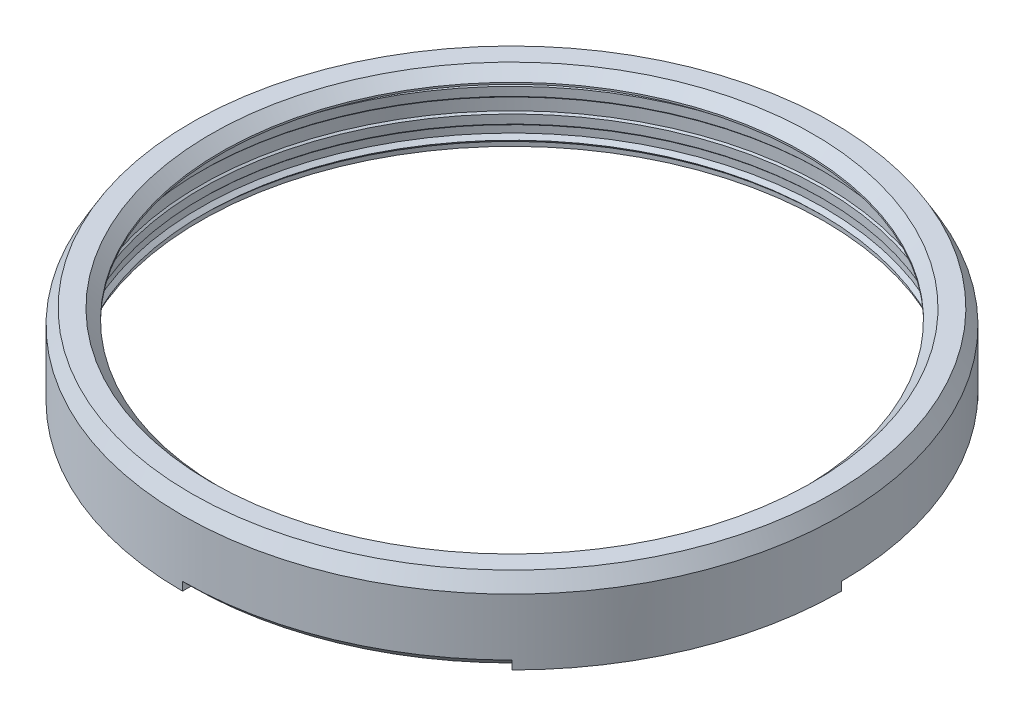
ISO-10303-21;
HEADER;
FILE_DESCRIPTION(('STEP AP214'),'2;1');
FILE_NAME('part.step','',(''),(''),'','','');
FILE_SCHEMA(('AUTOMOTIVE_DESIGN { 1 0 10303 214 1 1 1 1 }'));
ENDSEC;
DATA;
#1=APPLICATION_CONTEXT('core data for automotive mechanical design processes');
#2=APPLICATION_PROTOCOL_DEFINITION('international standard','automotive_design',2000,#1);
#3=PRODUCT_CONTEXT('',#1,'mechanical');
#4=PRODUCT('Part','Part','',(#3));
#5=PRODUCT_RELATED_PRODUCT_CATEGORY('part','',(#4));
#6=PRODUCT_DEFINITION_FORMATION('','',#4);
#7=PRODUCT_DEFINITION_CONTEXT('part definition',#1,'design');
#8=PRODUCT_DEFINITION('design','',#6,#7);
#9=PRODUCT_DEFINITION_SHAPE('','',#8);
#10=(LENGTH_UNIT() NAMED_UNIT(*) SI_UNIT(.MILLI.,.METRE.));
#11=(NAMED_UNIT(*) PLANE_ANGLE_UNIT() SI_UNIT($,.RADIAN.));
#12=(NAMED_UNIT(*) SI_UNIT($,.STERADIAN.) SOLID_ANGLE_UNIT());
#13=UNCERTAINTY_MEASURE_WITH_UNIT(LENGTH_MEASURE(1.E-05),#10,'distance_accuracy_value','');
#14=(GEOMETRIC_REPRESENTATION_CONTEXT(3) GLOBAL_UNCERTAINTY_ASSIGNED_CONTEXT((#13)) GLOBAL_UNIT_ASSIGNED_CONTEXT((#10,
#11,#12)) REPRESENTATION_CONTEXT('',''));
#15=CARTESIAN_POINT('',(0.,0.,0.));
#16=DIRECTION('',(0.,0.,1.));
#17=DIRECTION('',(1.,0.,0.));
#18=AXIS2_PLACEMENT_3D('',#15,#16,#17);
#19=CARTESIAN_POINT('',(0.,-1.39999999999984,0.));
#20=DIRECTION('',(0.,-1.,0.));
#21=DIRECTION('',(0.,0.,-1.));
#22=AXIS2_PLACEMENT_3D('',#19,#20,#21);
#23=TOROIDAL_SURFACE('',#22,35.0300000000002,1.39999999999979);
#24=CARTESIAN_POINT('',(0.,-1.39999999999984,0.));
#25=DIRECTION('',(0.,-1.,0.));
#26=DIRECTION('',(0.,0.,-1.));
#27=AXIS2_PLACEMENT_3D('',#24,#25,#26);
#28=CIRCLE('',#27,36.43);
#29=CARTESIAN_POINT('',(0.,-1.39999999999984,-36.43));
#30=VERTEX_POINT('',#29);
#31=EDGE_CURVE('E261',#30,#30,#28,.T.);
#32=ORIENTED_EDGE('',*,*,#31,.T.);
#33=EDGE_LOOP('',(#32));
#34=FACE_BOUND('',#33,.T.);
#35=CARTESIAN_POINT('',(0.,-0.0225022686044204,0.));
#36=DIRECTION('',(0.,-1.,0.));
#37=DIRECTION('',(0.,0.,-1.));
#38=AXIS2_PLACEMENT_3D('',#35,#36,#37);
#39=CIRCLE('',#38,35.28);
#40=CARTESIAN_POINT('',(0.,-0.0225022686044204,-35.28));
#41=VERTEX_POINT('',#40);
#42=EDGE_CURVE('E43',#41,#41,#39,.F.);
#43=ORIENTED_EDGE('',*,*,#42,.T.);
#44=EDGE_LOOP('',(#43));
#45=FACE_BOUND('',#44,.T.);
#46=ADVANCED_FACE('F38',(#34,#45),#23,.F.);
#47=CARTESIAN_POINT('',(0.,0.,0.));
#48=DIRECTION('',(0.,1.,0.));
#49=DIRECTION('',(0.,0.,1.));
#50=AXIS2_PLACEMENT_3D('',#47,#48,#49);
#51=PLANE('',#50);
#52=CARTESIAN_POINT('',(0.,0.,0.));
#53=DIRECTION('',(0.,1.,0.));
#54=DIRECTION('',(0.,0.,1.));
#55=AXIS2_PLACEMENT_3D('',#52,#53,#54);
#56=CIRCLE('',#55,34.);
#57=CARTESIAN_POINT('',(0.,0.,34.));
#58=VERTEX_POINT('',#57);
#59=EDGE_CURVE('E219',#58,#58,#56,.T.);
#60=ORIENTED_EDGE('',*,*,#59,.T.);
#61=EDGE_LOOP('',(#60));
#62=FACE_BOUND('',#61,.T.);
#63=CARTESIAN_POINT('',(0.,0.,0.));
#64=DIRECTION('',(0.,-1.,0.));
#65=DIRECTION('',(0.,0.,-1.));
#66=AXIS2_PLACEMENT_3D('',#63,#64,#65);
#67=CIRCLE('',#66,34.82);
#68=CARTESIAN_POINT('',(0.,0.,-34.82));
#69=VERTEX_POINT('',#68);
#70=EDGE_CURVE('E356',#69,#69,#67,.T.);
#71=ORIENTED_EDGE('',*,*,#70,.T.);
#72=EDGE_LOOP('',(#71));
#73=FACE_BOUND('',#72,.T.);
#74=ADVANCED_FACE('F292',(#62,#73),#51,.F.);
#75=CARTESIAN_POINT('',(0.,2.,0.));
#76=DIRECTION('',(0.,-1.,0.));
#77=DIRECTION('',(0.,0.,-1.));
#78=AXIS2_PLACEMENT_3D('',#75,#76,#77);
#79=CYLINDRICAL_SURFACE('',#78,38.5);
#80=CARTESIAN_POINT('',(0.,-0.332000000000011,0.));
#81=DIRECTION('',(0.,1.,0.));
#82=DIRECTION('',(0.,0.,1.));
#83=AXIS2_PLACEMENT_3D('',#80,#81,#82);
#84=CIRCLE('',#83,38.5);
#85=CARTESIAN_POINT('',(0.,-0.332000000000011,38.5));
#86=VERTEX_POINT('',#85);
#87=EDGE_CURVE('E269',#86,#86,#84,.F.);
#88=ORIENTED_EDGE('',*,*,#87,.T.);
#89=EDGE_LOOP('',(#88));
#90=FACE_BOUND('',#89,.T.);
#91=DIRECTION('',(0.,1.,0.));
#92=VECTOR('',#91,1.);
#93=CARTESIAN_POINT('',(-27.2236110756818,-8.00000000000001,-27.2236110756823));
#94=LINE('',#93,#92);
#95=CARTESIAN_POINT('',(-27.2236110756818,-8.00000000000001,-27.2236110756823));
#96=VERTEX_POINT('',#95);
#97=CARTESIAN_POINT('',(-27.2236110756818,-7.00000000000001,-27.2236110756823));
#98=VERTEX_POINT('',#97);
#99=EDGE_CURVE('E135',#96,#98,#94,.T.);
#100=ORIENTED_EDGE('',*,*,#99,.F.);
#101=CARTESIAN_POINT('',(0.,-8.00000000000001,0.));
#102=DIRECTION('',(0.,-1.,0.));
#103=DIRECTION('',(0.,0.,-1.));
#104=AXIS2_PLACEMENT_3D('',#101,#102,#103);
#105=CIRCLE('',#104,38.4999999999999);
#106=CARTESIAN_POINT('',(-38.4999999999999,-8.00000000000001,0.));
#107=VERTEX_POINT('',#106);
#108=EDGE_CURVE('E323',#107,#96,#105,.T.);
#109=ORIENTED_EDGE('',*,*,#108,.F.);
#110=DIRECTION('',(0.,1.,0.));
#111=VECTOR('',#110,1.);
#112=CARTESIAN_POINT('',(-38.5,-8.00000000000001,0.));
#113=LINE('',#112,#111);
#114=CARTESIAN_POINT('',(-38.5,-7.00000000000001,0.));
#115=VERTEX_POINT('',#114);
#116=EDGE_CURVE('E63',#107,#115,#113,.T.);
#117=ORIENTED_EDGE('',*,*,#116,.T.);
#118=CARTESIAN_POINT('',(0.,-7.00000000000001,0.));
#119=DIRECTION('',(0.,-1.,0.));
#120=DIRECTION('',(0.,0.,1.));
#121=AXIS2_PLACEMENT_3D('',#118,#119,#120);
#122=CIRCLE('',#121,38.5);
#123=CARTESIAN_POINT('',(-27.223611075682,-7.00000000000001,27.2236110756821));
#124=VERTEX_POINT('',#123);
#125=EDGE_CURVE('E143',#124,#115,#122,.T.);
#126=ORIENTED_EDGE('',*,*,#125,.F.);
#127=DIRECTION('',(0.,1.,0.));
#128=VECTOR('',#127,1.);
#129=CARTESIAN_POINT('',(-27.223611075682,-8.00000000000001,27.2236110756821));
#130=LINE('',#129,#128);
#131=CARTESIAN_POINT('',(-27.223611075682,-8.00000000000001,27.2236110756821));
#132=VERTEX_POINT('',#131);
#133=EDGE_CURVE('E149',#132,#124,#130,.T.);
#134=ORIENTED_EDGE('',*,*,#133,.F.);
#135=CARTESIAN_POINT('',(-1.34022322036767E-13,-8.00000000000001,38.4999999999999));
#136=VERTEX_POINT('',#135);
#137=EDGE_CURVE('E224',#136,#132,#105,.T.);
#138=ORIENTED_EDGE('',*,*,#137,.F.);
#139=DIRECTION('',(0.,1.,0.));
#140=VECTOR('',#139,1.);
#141=CARTESIAN_POINT('',(-1.34422031545461E-13,-8.00000000000001,38.5));
#142=LINE('',#141,#140);
#143=CARTESIAN_POINT('',(-1.34422031545461E-13,-7.00000000000001,38.5));
#144=VERTEX_POINT('',#143);
#145=EDGE_CURVE('E181',#136,#144,#142,.T.);
#146=ORIENTED_EDGE('',*,*,#145,.T.);
#147=CARTESIAN_POINT('',(0.,-7.00000000000001,0.));
#148=DIRECTION('',(0.,-1.,0.));
#149=DIRECTION('',(1.,0.,0.));
#150=AXIS2_PLACEMENT_3D('',#147,#148,#149);
#151=CIRCLE('',#150,38.5);
#152=CARTESIAN_POINT('',(27.223611075682,-7.00000000000001,27.2236110756821));
#153=VERTEX_POINT('',#152);
#154=EDGE_CURVE('E186',#153,#144,#151,.T.);
#155=ORIENTED_EDGE('',*,*,#154,.F.);
#156=DIRECTION('',(0.,1.,0.));
#157=VECTOR('',#156,1.);
#158=CARTESIAN_POINT('',(27.223611075682,-8.00000000000001,27.2236110756821));
#159=LINE('',#158,#157);
#160=CARTESIAN_POINT('',(27.223611075682,-8.00000000000001,27.2236110756821));
#161=VERTEX_POINT('',#160);
#162=EDGE_CURVE('E194',#161,#153,#159,.T.);
#163=ORIENTED_EDGE('',*,*,#162,.F.);
#164=CARTESIAN_POINT('',(38.4999999999999,-8.00000000000001,0.));
#165=VERTEX_POINT('',#164);
#166=EDGE_CURVE('E220',#165,#161,#105,.T.);
#167=ORIENTED_EDGE('',*,*,#166,.F.);
#168=DIRECTION('',(0.,1.,0.));
#169=VECTOR('',#168,1.);
#170=CARTESIAN_POINT('',(38.5,-8.00000000000001,0.));
#171=LINE('',#170,#169);
#172=CARTESIAN_POINT('',(38.5,-7.00000000000001,0.));
#173=VERTEX_POINT('',#172);
#174=EDGE_CURVE('E200',#165,#173,#171,.T.);
#175=ORIENTED_EDGE('',*,*,#174,.T.);
#176=CARTESIAN_POINT('',(0.,-7.00000000000001,0.));
#177=DIRECTION('',(0.,-1.,0.));
#178=DIRECTION('',(0.,0.,-1.));
#179=AXIS2_PLACEMENT_3D('',#176,#177,#178);
#180=CIRCLE('',#179,38.5);
#181=CARTESIAN_POINT('',(27.223611075682,-7.00000000000001,-27.2236110756821));
#182=VERTEX_POINT('',#181);
#183=EDGE_CURVE('E217',#182,#173,#180,.T.);
#184=ORIENTED_EDGE('',*,*,#183,.F.);
#185=DIRECTION('',(0.,1.,0.));
#186=VECTOR('',#185,1.);
#187=CARTESIAN_POINT('',(27.223611075682,-8.00000000000001,-27.2236110756821));
#188=LINE('',#187,#186);
#189=CARTESIAN_POINT('',(27.223611075682,-8.00000000000001,-27.2236110756821));
#190=VERTEX_POINT('',#189);
#191=EDGE_CURVE('E209',#190,#182,#188,.T.);
#192=ORIENTED_EDGE('',*,*,#191,.F.);
#193=CARTESIAN_POINT('',(4.04465223162458E-13,-8.00000000000001,-38.4999999999999));
#194=VERTEX_POINT('',#193);
#195=EDGE_CURVE('E225',#194,#190,#105,.T.);
#196=ORIENTED_EDGE('',*,*,#195,.F.);
#197=DIRECTION('',(0.,1.,0.));
#198=VECTOR('',#197,1.);
#199=CARTESIAN_POINT('',(4.03266094636382E-13,-8.00000000000001,-38.5));
#200=LINE('',#199,#198);
#201=CARTESIAN_POINT('',(4.03266094636382E-13,-7.00000000000001,-38.5));
#202=VERTEX_POINT('',#201);
#203=EDGE_CURVE('E55',#194,#202,#200,.T.);
#204=ORIENTED_EDGE('',*,*,#203,.T.);
#205=CARTESIAN_POINT('',(0.,-7.00000000000001,0.));
#206=DIRECTION('',(0.,-1.,0.));
#207=DIRECTION('',(-1.,0.,0.));
#208=AXIS2_PLACEMENT_3D('',#205,#206,#207);
#209=CIRCLE('',#208,38.5);
#210=EDGE_CURVE('E166',#98,#202,#209,.T.);
#211=ORIENTED_EDGE('',*,*,#210,.F.);
#212=EDGE_LOOP('',(#100,#109,#117,#126,#134,#138,#146,#155,#163,#167,#175,#184,#192,#196,#204,#211));
#213=FACE_BOUND('',#212,.T.);
#214=ADVANCED_FACE('F298',(#90,#213),#79,.T.);
#215=CARTESIAN_POINT('',(35.9428464201426,-8.00000000000001,-13.797166057493));
#216=DIRECTION('',(0.,-1.,0.));
#217=DIRECTION('',(0.,0.,-1.));
#218=AXIS2_PLACEMENT_3D('',#215,#216,#217);
#219=PLANE('',#218);
#220=CARTESIAN_POINT('',(0.,-8.00000000000001,0.));
#221=DIRECTION('',(0.,-1.,0.));
#222=DIRECTION('',(0.,0.,-1.));
#223=AXIS2_PLACEMENT_3D('',#220,#221,#222);
#224=CIRCLE('',#223,36.43);
#225=CARTESIAN_POINT('',(0.,-8.00000000000001,-36.43));
#226=VERTEX_POINT('',#225);
#227=EDGE_CURVE('E223',#226,#226,#224,.T.);
#228=ORIENTED_EDGE('',*,*,#227,.F.);
#229=EDGE_LOOP('',(#228));
#230=FACE_BOUND('',#229,.T.);
#231=ORIENTED_EDGE('',*,*,#108,.T.);
#232=DIRECTION('',(-0.707106781186541,0.,-0.707106781186554));
#233=VECTOR('',#232,1.);
#234=CARTESIAN_POINT('',(-26.5165042944953,-8.00000000000001,-26.5165042944958));
#235=LINE('',#234,#233);
#236=CARTESIAN_POINT('',(-26.5165042944953,-8.00000000000001,-26.5165042944958));
#237=VERTEX_POINT('',#236);
#238=EDGE_CURVE('E172',#237,#96,#235,.T.);
#239=ORIENTED_EDGE('',*,*,#238,.F.);
#240=CARTESIAN_POINT('',(0.,-8.00000000000001,0.));
#241=DIRECTION('',(0.,-1.,0.));
#242=DIRECTION('',(-1.,0.,0.));
#243=AXIS2_PLACEMENT_3D('',#240,#241,#242);
#244=CIRCLE('',#243,37.5);
#245=CARTESIAN_POINT('',(3.92791650619852E-13,-8.00000000000001,-37.5));
#246=VERTEX_POINT('',#245);
#247=EDGE_CURVE('E169',#237,#246,#244,.T.);
#248=ORIENTED_EDGE('',*,*,#247,.T.);
#249=DIRECTION('',(0.,0.,-1.));
#250=VECTOR('',#249,1.);
#251=CARTESIAN_POINT('',(3.92791650619852E-13,-8.00000000000001,-37.5));
#252=LINE('',#251,#250);
#253=EDGE_CURVE('E158',#246,#194,#252,.T.);
#254=ORIENTED_EDGE('',*,*,#253,.T.);
#255=ORIENTED_EDGE('',*,*,#195,.T.);
#256=DIRECTION('',(0.707106781186546,0.,-0.707106781186549));
#257=VECTOR('',#256,1.);
#258=CARTESIAN_POINT('',(26.5165042944955,-8.00000000000001,-26.5165042944956));
#259=LINE('',#258,#257);
#260=CARTESIAN_POINT('',(26.5165042944955,-8.00000000000001,-26.5165042944956));
#261=VERTEX_POINT('',#260);
#262=EDGE_CURVE('E206',#261,#190,#259,.T.);
#263=ORIENTED_EDGE('',*,*,#262,.F.);
#264=CARTESIAN_POINT('',(0.,-8.00000000000001,0.));
#265=DIRECTION('',(0.,-1.,0.));
#266=DIRECTION('',(0.,0.,-1.));
#267=AXIS2_PLACEMENT_3D('',#264,#265,#266);
#268=CIRCLE('',#267,37.5);
#269=CARTESIAN_POINT('',(37.5,-8.00000000000001,0.));
#270=VERTEX_POINT('',#269);
#271=EDGE_CURVE('E214',#261,#270,#268,.T.);
#272=ORIENTED_EDGE('',*,*,#271,.T.);
#273=DIRECTION('',(1.,0.,0.));
#274=VECTOR('',#273,1.);
#275=CARTESIAN_POINT('',(37.5,-8.00000000000001,0.));
#276=LINE('',#275,#274);
#277=EDGE_CURVE('E197',#270,#165,#276,.T.);
#278=ORIENTED_EDGE('',*,*,#277,.T.);
#279=ORIENTED_EDGE('',*,*,#166,.T.);
#280=DIRECTION('',(0.707106781186546,0.,0.707106781186549));
#281=VECTOR('',#280,1.);
#282=CARTESIAN_POINT('',(26.5165042944955,-8.00000000000001,26.5165042944956));
#283=LINE('',#282,#281);
#284=CARTESIAN_POINT('',(26.5165042944955,-8.00000000000001,26.5165042944956));
#285=VERTEX_POINT('',#284);
#286=EDGE_CURVE('E192',#285,#161,#283,.T.);
#287=ORIENTED_EDGE('',*,*,#286,.F.);
#288=CARTESIAN_POINT('',(0.,-8.00000000000001,0.));
#289=DIRECTION('',(0.,-1.,0.));
#290=DIRECTION('',(1.,0.,0.));
#291=AXIS2_PLACEMENT_3D('',#288,#289,#290);
#292=CIRCLE('',#291,37.5);
#293=CARTESIAN_POINT('',(-1.30930550206618E-13,-8.00000000000001,37.5));
#294=VERTEX_POINT('',#293);
#295=EDGE_CURVE('E189',#285,#294,#292,.T.);
#296=ORIENTED_EDGE('',*,*,#295,.T.);
#297=DIRECTION('',(0.,0.,1.));
#298=VECTOR('',#297,1.);
#299=CARTESIAN_POINT('',(-1.30930550206618E-13,-8.00000000000001,37.5));
#300=LINE('',#299,#298);
#301=EDGE_CURVE('E157',#294,#136,#300,.T.);
#302=ORIENTED_EDGE('',*,*,#301,.T.);
#303=ORIENTED_EDGE('',*,*,#137,.T.);
#304=DIRECTION('',(-0.707106781186546,0.,0.707106781186549));
#305=VECTOR('',#304,1.);
#306=CARTESIAN_POINT('',(-26.5165042944955,-8.00000000000001,26.5165042944956));
#307=LINE('',#306,#305);
#308=CARTESIAN_POINT('',(-26.5165042944955,-8.00000000000001,26.5165042944956));
#309=VERTEX_POINT('',#308);
#310=EDGE_CURVE('E147',#309,#132,#307,.T.);
#311=ORIENTED_EDGE('',*,*,#310,.F.);
#312=CARTESIAN_POINT('',(0.,-8.00000000000001,0.));
#313=DIRECTION('',(0.,-1.,0.));
#314=DIRECTION('',(0.,0.,1.));
#315=AXIS2_PLACEMENT_3D('',#312,#313,#314);
#316=CIRCLE('',#315,37.5);
#317=CARTESIAN_POINT('',(-37.5,-8.00000000000001,0.));
#318=VERTEX_POINT('',#317);
#319=EDGE_CURVE('E140',#309,#318,#316,.T.);
#320=ORIENTED_EDGE('',*,*,#319,.T.);
#321=DIRECTION('',(-1.,0.,0.));
#322=VECTOR('',#321,1.);
#323=CARTESIAN_POINT('',(-37.5,-8.00000000000001,0.));
#324=LINE('',#323,#322);
#325=EDGE_CURVE('E126',#318,#107,#324,.T.);
#326=ORIENTED_EDGE('',*,*,#325,.T.);
#327=EDGE_LOOP('',(#231,#239,#248,#254,#255,#263,#272,#278,#279,#287,#296,#302,#303,#311,#320,#326));
#328=FACE_BOUND('',#327,.T.);
#329=ADVANCED_FACE('F145',(#230,#328),#219,.T.);
#330=CARTESIAN_POINT('',(0.,-8.00000000000001,0.));
#331=DIRECTION('',(0.,1.,0.));
#332=DIRECTION('',(0.,0.,1.));
#333=AXIS2_PLACEMENT_3D('',#330,#331,#332);
#334=CYLINDRICAL_SURFACE('',#333,34.);
#335=CARTESIAN_POINT('',(0.,0.199999999999987,0.));
#336=DIRECTION('',(0.,1.,0.));
#337=DIRECTION('',(0.,0.,1.));
#338=AXIS2_PLACEMENT_3D('',#335,#336,#337);
#339=CIRCLE('',#338,34.);
#340=CARTESIAN_POINT('',(0.,0.199999999999987,34.));
#341=VERTEX_POINT('',#340);
#342=EDGE_CURVE('E11',#341,#341,#339,.T.);
#343=ORIENTED_EDGE('',*,*,#342,.T.);
#344=EDGE_LOOP('',(#343));
#345=FACE_BOUND('',#344,.T.);
#346=ORIENTED_EDGE('',*,*,#59,.F.);
#347=EDGE_LOOP('',(#346));
#348=FACE_BOUND('',#347,.T.);
#349=ADVANCED_FACE('F316',(#345,#348),#334,.F.);
#350=CARTESIAN_POINT('',(0.,0.,0.));
#351=DIRECTION('',(0.,-1.,0.));
#352=DIRECTION('',(0.,0.,-1.));
#353=AXIS2_PLACEMENT_3D('',#350,#351,#352);
#354=CYLINDRICAL_SURFACE('',#353,36.43);
#355=CARTESIAN_POINT('',(0.,-1.59999999999962,0.));
#356=DIRECTION('',(0.,-1.,0.));
#357=DIRECTION('',(0.,0.,-1.));
#358=AXIS2_PLACEMENT_3D('',#355,#356,#357);
#359=CIRCLE('',#358,36.43);
#360=CARTESIAN_POINT('',(0.,-1.59999999999962,-36.43));
#361=VERTEX_POINT('',#360);
#362=EDGE_CURVE('E258',#361,#361,#359,.T.);
#363=ORIENTED_EDGE('',*,*,#362,.T.);
#364=EDGE_LOOP('',(#363));
#365=FACE_BOUND('',#364,.T.);
#366=ORIENTED_EDGE('',*,*,#31,.F.);
#367=EDGE_LOOP('',(#366));
#368=FACE_BOUND('',#367,.T.);
#369=ADVANCED_FACE('F303',(#365,#368),#354,.F.);
#370=CARTESIAN_POINT('',(0.,-1.59999999999962,0.));
#371=DIRECTION('',(0.,1.,0.));
#372=DIRECTION('',(0.,0.,1.));
#373=AXIS2_PLACEMENT_3D('',#370,#371,#372);
#374=CONICAL_SURFACE('',#373,36.43,0.785398163397411);
#375=CARTESIAN_POINT('',(0.,-1.78999999999965,0.));
#376=DIRECTION('',(0.,-1.,0.));
#377=DIRECTION('',(0.,0.,-1.));
#378=AXIS2_PLACEMENT_3D('',#375,#376,#377);
#379=CIRCLE('',#378,36.24);
#380=CARTESIAN_POINT('',(0.,-1.78999999999965,-36.24));
#381=VERTEX_POINT('',#380);
#382=EDGE_CURVE('E255',#381,#381,#379,.T.);
#383=ORIENTED_EDGE('',*,*,#382,.T.);
#384=EDGE_LOOP('',(#383));
#385=FACE_BOUND('',#384,.T.);
#386=ORIENTED_EDGE('',*,*,#362,.F.);
#387=EDGE_LOOP('',(#386));
#388=FACE_BOUND('',#387,.T.);
#389=ADVANCED_FACE('F446',(#385,#388),#374,.F.);
#390=CARTESIAN_POINT('',(0.,0.,0.));
#391=DIRECTION('',(0.,-1.,0.));
#392=DIRECTION('',(0.,0.,-1.));
#393=AXIS2_PLACEMENT_3D('',#390,#391,#392);
#394=CYLINDRICAL_SURFACE('',#393,36.24);
#395=CARTESIAN_POINT('',(0.,-2.80999999999966,0.));
#396=DIRECTION('',(0.,-1.,0.));
#397=DIRECTION('',(0.,0.,-1.));
#398=AXIS2_PLACEMENT_3D('',#395,#396,#397);
#399=CIRCLE('',#398,36.24);
#400=CARTESIAN_POINT('',(0.,-2.80999999999966,-36.24));
#401=VERTEX_POINT('',#400);
#402=EDGE_CURVE('E252',#401,#401,#399,.T.);
#403=ORIENTED_EDGE('',*,*,#402,.T.);
#404=EDGE_LOOP('',(#403));
#405=FACE_BOUND('',#404,.T.);
#406=ORIENTED_EDGE('',*,*,#382,.F.);
#407=EDGE_LOOP('',(#406));
#408=FACE_BOUND('',#407,.T.);
#409=ADVANCED_FACE('F443',(#405,#408),#394,.F.);
#410=CARTESIAN_POINT('',(0.,-2.80999999999966,0.));
#411=DIRECTION('',(0.,-1.,0.));
#412=DIRECTION('',(0.,0.,-1.));
#413=AXIS2_PLACEMENT_3D('',#410,#411,#412);
#414=CONICAL_SURFACE('',#413,36.24,0.785398163397501);
#415=CARTESIAN_POINT('',(0.,-2.99999999999965,0.));
#416=DIRECTION('',(0.,-1.,0.));
#417=DIRECTION('',(0.,0.,-1.));
#418=AXIS2_PLACEMENT_3D('',#415,#416,#417);
#419=CIRCLE('',#418,36.43);
#420=CARTESIAN_POINT('',(0.,-2.99999999999965,-36.43));
#421=VERTEX_POINT('',#420);
#422=EDGE_CURVE('E249',#421,#421,#419,.T.);
#423=ORIENTED_EDGE('',*,*,#422,.T.);
#424=EDGE_LOOP('',(#423));
#425=FACE_BOUND('',#424,.T.);
#426=ORIENTED_EDGE('',*,*,#402,.F.);
#427=EDGE_LOOP('',(#426));
#428=FACE_BOUND('',#427,.T.);
#429=ADVANCED_FACE('F439',(#425,#428),#414,.F.);
#430=CARTESIAN_POINT('',(0.,0.,0.));
#431=DIRECTION('',(0.,-1.,0.));
#432=DIRECTION('',(0.,0.,-1.));
#433=AXIS2_PLACEMENT_3D('',#430,#431,#432);
#434=CYLINDRICAL_SURFACE('',#433,36.43);
#435=CARTESIAN_POINT('',(0.,-4.39999999999964,0.));
#436=DIRECTION('',(0.,-1.,0.));
#437=DIRECTION('',(0.,0.,-1.));
#438=AXIS2_PLACEMENT_3D('',#435,#436,#437);
#439=CIRCLE('',#438,36.43);
#440=CARTESIAN_POINT('',(0.,-4.39999999999964,-36.43));
#441=VERTEX_POINT('',#440);
#442=EDGE_CURVE('E246',#441,#441,#439,.T.);
#443=ORIENTED_EDGE('',*,*,#442,.T.);
#444=EDGE_LOOP('',(#443));
#445=FACE_BOUND('',#444,.T.);
#446=ORIENTED_EDGE('',*,*,#422,.F.);
#447=EDGE_LOOP('',(#446));
#448=FACE_BOUND('',#447,.T.);
#449=ADVANCED_FACE('F435',(#445,#448),#434,.F.);
#450=CARTESIAN_POINT('',(0.,-4.39999999999964,0.));
#451=DIRECTION('',(0.,1.,0.));
#452=DIRECTION('',(0.,0.,1.));
#453=AXIS2_PLACEMENT_3D('',#450,#451,#452);
#454=CONICAL_SURFACE('',#453,36.43,0.785398163397382);
#455=CARTESIAN_POINT('',(0.,-4.58999999999968,0.));
#456=DIRECTION('',(0.,-1.,0.));
#457=DIRECTION('',(0.,0.,-1.));
#458=AXIS2_PLACEMENT_3D('',#455,#456,#457);
#459=CIRCLE('',#458,36.24);
#460=CARTESIAN_POINT('',(0.,-4.58999999999968,-36.24));
#461=VERTEX_POINT('',#460);
#462=EDGE_CURVE('E243',#461,#461,#459,.T.);
#463=ORIENTED_EDGE('',*,*,#462,.T.);
#464=EDGE_LOOP('',(#463));
#465=FACE_BOUND('',#464,.T.);
#466=ORIENTED_EDGE('',*,*,#442,.F.);
#467=EDGE_LOOP('',(#466));
#468=FACE_BOUND('',#467,.T.);
#469=ADVANCED_FACE('F431',(#465,#468),#454,.F.);
#470=CARTESIAN_POINT('',(0.,0.,0.));
#471=DIRECTION('',(0.,-1.,0.));
#472=DIRECTION('',(0.,0.,-1.));
#473=AXIS2_PLACEMENT_3D('',#470,#471,#472);
#474=CYLINDRICAL_SURFACE('',#473,36.24);
#475=CARTESIAN_POINT('',(0.,-5.60999999999965,0.));
#476=DIRECTION('',(0.,-1.,0.));
#477=DIRECTION('',(0.,0.,-1.));
#478=AXIS2_PLACEMENT_3D('',#475,#476,#477);
#479=CIRCLE('',#478,36.24);
#480=CARTESIAN_POINT('',(0.,-5.60999999999965,-36.24));
#481=VERTEX_POINT('',#480);
#482=EDGE_CURVE('E240',#481,#481,#479,.T.);
#483=ORIENTED_EDGE('',*,*,#482,.T.);
#484=EDGE_LOOP('',(#483));
#485=FACE_BOUND('',#484,.T.);
#486=ORIENTED_EDGE('',*,*,#462,.F.);
#487=EDGE_LOOP('',(#486));
#488=FACE_BOUND('',#487,.T.);
#489=ADVANCED_FACE('F427',(#485,#488),#474,.F.);
#490=CARTESIAN_POINT('',(0.,-5.60999999999965,0.));
#491=DIRECTION('',(0.,-1.,0.));
#492=DIRECTION('',(0.,0.,-1.));
#493=AXIS2_PLACEMENT_3D('',#490,#491,#492);
#494=CONICAL_SURFACE('',#493,36.24,0.785398163397496);
#495=CARTESIAN_POINT('',(0.,-5.79999999999965,0.));
#496=DIRECTION('',(0.,-1.,0.));
#497=DIRECTION('',(0.,0.,-1.));
#498=AXIS2_PLACEMENT_3D('',#495,#496,#497);
#499=CIRCLE('',#498,36.43);
#500=CARTESIAN_POINT('',(0.,-5.79999999999965,-36.43));
#501=VERTEX_POINT('',#500);
#502=EDGE_CURVE('E237',#501,#501,#499,.T.);
#503=ORIENTED_EDGE('',*,*,#502,.T.);
#504=EDGE_LOOP('',(#503));
#505=FACE_BOUND('',#504,.T.);
#506=ORIENTED_EDGE('',*,*,#482,.F.);
#507=EDGE_LOOP('',(#506));
#508=FACE_BOUND('',#507,.T.);
#509=ADVANCED_FACE('F423',(#505,#508),#494,.F.);
#510=CARTESIAN_POINT('',(0.,0.,0.));
#511=DIRECTION('',(0.,-1.,0.));
#512=DIRECTION('',(0.,0.,-1.));
#513=AXIS2_PLACEMENT_3D('',#510,#511,#512);
#514=CYLINDRICAL_SURFACE('',#513,36.43);
#515=CARTESIAN_POINT('',(0.,-6.64999999999965,0.));
#516=DIRECTION('',(0.,-1.,0.));
#517=DIRECTION('',(0.,0.,-1.));
#518=AXIS2_PLACEMENT_3D('',#515,#516,#517);
#519=CIRCLE('',#518,36.43);
#520=CARTESIAN_POINT('',(0.,-6.64999999999965,-36.43));
#521=VERTEX_POINT('',#520);
#522=EDGE_CURVE('E234',#521,#521,#519,.T.);
#523=ORIENTED_EDGE('',*,*,#522,.T.);
#524=EDGE_LOOP('',(#523));
#525=FACE_BOUND('',#524,.T.);
#526=ORIENTED_EDGE('',*,*,#502,.F.);
#527=EDGE_LOOP('',(#526));
#528=FACE_BOUND('',#527,.T.);
#529=ADVANCED_FACE('F419',(#525,#528),#514,.F.);
#530=CARTESIAN_POINT('',(0.,-6.64999999999965,0.));
#531=DIRECTION('',(0.,1.,0.));
#532=DIRECTION('',(0.,0.,1.));
#533=AXIS2_PLACEMENT_3D('',#530,#531,#532);
#534=CONICAL_SURFACE('',#533,36.43,0.785398163397377);
#535=CARTESIAN_POINT('',(0.,-7.07499999999987,0.));
#536=DIRECTION('',(0.,-1.,0.));
#537=DIRECTION('',(0.,0.,-1.));
#538=AXIS2_PLACEMENT_3D('',#535,#536,#537);
#539=CIRCLE('',#538,36.0049999999999);
#540=CARTESIAN_POINT('',(0.,-7.07499999999987,-36.0049999999999));
#541=VERTEX_POINT('',#540);
#542=EDGE_CURVE('E231',#541,#541,#539,.T.);
#543=ORIENTED_EDGE('',*,*,#542,.T.);
#544=EDGE_LOOP('',(#543));
#545=FACE_BOUND('',#544,.T.);
#546=ORIENTED_EDGE('',*,*,#522,.F.);
#547=EDGE_LOOP('',(#546));
#548=FACE_BOUND('',#547,.T.);
#549=ADVANCED_FACE('F415',(#545,#548),#534,.F.);
#550=CARTESIAN_POINT('',(0.,-7.07499999999987,0.));
#551=DIRECTION('',(0.,-1.,0.));
#552=DIRECTION('',(0.,0.,-1.));
#553=AXIS2_PLACEMENT_3D('',#550,#551,#552);
#554=CONICAL_SURFACE('',#553,36.0049999999999,0.785398163397493);
#555=CARTESIAN_POINT('',(0.,-7.5,0.));
#556=DIRECTION('',(0.,-1.,0.));
#557=DIRECTION('',(0.,0.,-1.));
#558=AXIS2_PLACEMENT_3D('',#555,#556,#557);
#559=CIRCLE('',#558,36.43);
#560=CARTESIAN_POINT('',(0.,-7.5,-36.43));
#561=VERTEX_POINT('',#560);
#562=EDGE_CURVE('E228',#561,#561,#559,.T.);
#563=ORIENTED_EDGE('',*,*,#562,.T.);
#564=EDGE_LOOP('',(#563));
#565=FACE_BOUND('',#564,.T.);
#566=ORIENTED_EDGE('',*,*,#542,.F.);
#567=EDGE_LOOP('',(#566));
#568=FACE_BOUND('',#567,.T.);
#569=ADVANCED_FACE('F411',(#565,#568),#554,.F.);
#570=CARTESIAN_POINT('',(0.,0.,0.));
#571=DIRECTION('',(0.,-1.,0.));
#572=DIRECTION('',(0.,0.,-1.));
#573=AXIS2_PLACEMENT_3D('',#570,#571,#572);
#574=CYLINDRICAL_SURFACE('',#573,36.43);
#575=ORIENTED_EDGE('',*,*,#227,.T.);
#576=EDGE_LOOP('',(#575));
#577=FACE_BOUND('',#576,.T.);
#578=ORIENTED_EDGE('',*,*,#562,.F.);
#579=EDGE_LOOP('',(#578));
#580=FACE_BOUND('',#579,.T.);
#581=ADVANCED_FACE('F405',(#577,#580),#574,.F.);
#582=CARTESIAN_POINT('',(0.,1.4,0.));
#583=DIRECTION('',(0.,1.,0.));
#584=DIRECTION('',(0.,0.,1.));
#585=AXIS2_PLACEMENT_3D('',#582,#583,#584);
#586=PLANE('',#585);
#587=CARTESIAN_POINT('',(0.,1.4,0.));
#588=DIRECTION('',(0.,1.,0.));
#589=DIRECTION('',(0.,0.,1.));
#590=AXIS2_PLACEMENT_3D('',#587,#588,#589);
#591=CIRCLE('',#590,35.2);
#592=CARTESIAN_POINT('',(0.,1.4,35.2));
#593=VERTEX_POINT('',#592);
#594=EDGE_CURVE('E48',#593,#593,#591,.F.);
#595=ORIENTED_EDGE('',*,*,#594,.T.);
#596=EDGE_LOOP('',(#595));
#597=FACE_BOUND('',#596,.T.);
#598=CARTESIAN_POINT('',(0.,1.4,0.));
#599=DIRECTION('',(0.,1.,0.));
#600=DIRECTION('',(0.,0.,1.));
#601=AXIS2_PLACEMENT_3D('',#598,#599,#600);
#602=CIRCLE('',#601,37.5000293337636);
#603=CARTESIAN_POINT('',(0.,1.4,37.5000293337636));
#604=VERTEX_POINT('',#603);
#605=EDGE_CURVE('E264',#604,#604,#602,.T.);
#606=ORIENTED_EDGE('',*,*,#605,.T.);
#607=EDGE_LOOP('',(#606));
#608=FACE_BOUND('',#607,.T.);
#609=ADVANCED_FACE('F275',(#597,#608),#586,.T.);
#610=CARTESIAN_POINT('',(0.,1.4,0.));
#611=DIRECTION('',(0.,-1.,0.));
#612=DIRECTION('',(0.,0.,-1.));
#613=AXIS2_PLACEMENT_3D('',#610,#611,#612);
#614=CONICAL_SURFACE('',#613,37.5000293337636,0.523598775598298);
#615=ORIENTED_EDGE('',*,*,#87,.F.);
#616=EDGE_LOOP('',(#615));
#617=FACE_BOUND('',#616,.T.);
#618=ORIENTED_EDGE('',*,*,#605,.F.);
#619=EDGE_LOOP('',(#618));
#620=FACE_BOUND('',#619,.T.);
#621=ADVANCED_FACE('F280',(#617,#620),#614,.T.);
#622=CARTESIAN_POINT('',(0.,1.4,0.));
#623=DIRECTION('',(0.,1.,0.));
#624=DIRECTION('',(0.,0.,1.));
#625=AXIS2_PLACEMENT_3D('',#622,#623,#624);
#626=CONICAL_SURFACE('',#625,35.2,0.785398163397445);
#627=ORIENTED_EDGE('',*,*,#342,.F.);
#628=EDGE_LOOP('',(#627));
#629=FACE_BOUND('',#628,.T.);
#630=ORIENTED_EDGE('',*,*,#594,.F.);
#631=EDGE_LOOP('',(#630));
#632=FACE_BOUND('',#631,.T.);
#633=ADVANCED_FACE('F41',(#629,#632),#626,.F.);
#634=CARTESIAN_POINT('',(0.,-7.00000000000001,0.));
#635=DIRECTION('',(0.,1.,0.));
#636=DIRECTION('',(0.,0.,1.));
#637=AXIS2_PLACEMENT_3D('',#634,#635,#636);
#638=CONICAL_SURFACE('',#637,38.5,0.785398163397445);
#639=DIRECTION('',(-0.499999999999999,-0.707106781186547,0.500000000000001));
#640=VECTOR('',#639,1.);
#641=CARTESIAN_POINT('',(27.223611075682,-7.00000000000001,-27.2236110756821));
#642=LINE('',#641,#640);
#643=EDGE_CURVE('E211',#182,#261,#642,.T.);
#644=ORIENTED_EDGE('',*,*,#643,.F.);
#645=ORIENTED_EDGE('',*,*,#183,.T.);
#646=DIRECTION('',(-0.707106781186548,-0.707106781186547,0.));
#647=VECTOR('',#646,1.);
#648=CARTESIAN_POINT('',(38.5,-7.00000000000001,0.));
#649=LINE('',#648,#647);
#650=EDGE_CURVE('E203',#173,#270,#649,.T.);
#651=ORIENTED_EDGE('',*,*,#650,.T.);
#652=ORIENTED_EDGE('',*,*,#271,.F.);
#653=EDGE_LOOP('',(#644,#645,#651,#652));
#654=FACE_BOUND('',#653,.T.);
#655=ADVANCED_FACE('F279',(#654),#638,.T.);
#656=CARTESIAN_POINT('',(0.,0.,0.));
#657=DIRECTION('',(0.707106781186549,0.,0.707106781186546));
#658=DIRECTION('',(0.707106781186546,0.,-0.707106781186549));
#659=AXIS2_PLACEMENT_3D('',#656,#657,#658);
#660=PLANE('',#659);
#661=ORIENTED_EDGE('',*,*,#262,.T.);
#662=ORIENTED_EDGE('',*,*,#191,.T.);
#663=ORIENTED_EDGE('',*,*,#643,.T.);
#664=EDGE_LOOP('',(#661,#662,#663));
#665=FACE_BOUND('',#664,.T.);
#666=ADVANCED_FACE('F286',(#665),#660,.T.);
#667=CARTESIAN_POINT('',(0.,0.,0.));
#668=DIRECTION('',(0.,0.,1.));
#669=DIRECTION('',(1.,0.,0.));
#670=AXIS2_PLACEMENT_3D('',#667,#668,#669);
#671=PLANE('',#670);
#672=ORIENTED_EDGE('',*,*,#277,.F.);
#673=ORIENTED_EDGE('',*,*,#650,.F.);
#674=ORIENTED_EDGE('',*,*,#174,.F.);
#675=EDGE_LOOP('',(#672,#673,#674));
#676=FACE_BOUND('',#675,.T.);
#677=ADVANCED_FACE('F335',(#676),#671,.F.);
#678=CARTESIAN_POINT('',(0.,0.,0.));
#679=DIRECTION('',(-0.707106781186549,0.,0.707106781186546));
#680=DIRECTION('',(0.707106781186546,0.,0.707106781186549));
#681=AXIS2_PLACEMENT_3D('',#678,#679,#680);
#682=PLANE('',#681);
#683=ORIENTED_EDGE('',*,*,#286,.T.);
#684=ORIENTED_EDGE('',*,*,#162,.T.);
#685=DIRECTION('',(-0.499999999999999,-0.707106781186547,-0.500000000000001));
#686=VECTOR('',#685,1.);
#687=CARTESIAN_POINT('',(27.223611075682,-7.00000000000001,27.2236110756821));
#688=LINE('',#687,#686);
#689=EDGE_CURVE('E184',#153,#285,#688,.T.);
#690=ORIENTED_EDGE('',*,*,#689,.T.);
#691=EDGE_LOOP('',(#683,#684,#690));
#692=FACE_BOUND('',#691,.T.);
#693=ADVANCED_FACE('F340',(#692),#682,.T.);
#694=CARTESIAN_POINT('',(0.,-7.00000000000001,0.));
#695=DIRECTION('',(0.,1.,0.));
#696=DIRECTION('',(-1.,0.,0.));
#697=AXIS2_PLACEMENT_3D('',#694,#695,#696);
#698=CONICAL_SURFACE('',#697,38.5,0.785398163397445);
#699=ORIENTED_EDGE('',*,*,#689,.F.);
#700=ORIENTED_EDGE('',*,*,#154,.T.);
#701=DIRECTION('',(0.,-0.707106781186547,-0.707106781186548));
#702=VECTOR('',#701,1.);
#703=CARTESIAN_POINT('',(-1.34422031545461E-13,-7.00000000000001,38.5));
#704=LINE('',#703,#702);
#705=EDGE_CURVE('E178',#144,#294,#704,.T.);
#706=ORIENTED_EDGE('',*,*,#705,.T.);
#707=ORIENTED_EDGE('',*,*,#295,.F.);
#708=EDGE_LOOP('',(#699,#700,#706,#707));
#709=FACE_BOUND('',#708,.T.);
#710=ADVANCED_FACE('F344',(#709),#698,.T.);
#711=CARTESIAN_POINT('',(0.,0.,0.));
#712=DIRECTION('',(-1.,0.,0.));
#713=DIRECTION('',(0.,0.,1.));
#714=AXIS2_PLACEMENT_3D('',#711,#712,#713);
#715=PLANE('',#714);
#716=ORIENTED_EDGE('',*,*,#301,.F.);
#717=ORIENTED_EDGE('',*,*,#705,.F.);
#718=ORIENTED_EDGE('',*,*,#145,.F.);
#719=EDGE_LOOP('',(#716,#717,#718));
#720=FACE_BOUND('',#719,.T.);
#721=ADVANCED_FACE('F346',(#720),#715,.F.);
#722=CARTESIAN_POINT('',(0.,0.,0.));
#723=DIRECTION('',(-0.707106781186549,0.,-0.707106781186546));
#724=DIRECTION('',(-0.707106781186546,0.,0.707106781186549));
#725=AXIS2_PLACEMENT_3D('',#722,#723,#724);
#726=PLANE('',#725);
#727=ORIENTED_EDGE('',*,*,#310,.T.);
#728=ORIENTED_EDGE('',*,*,#133,.T.);
#729=DIRECTION('',(0.499999999999999,-0.707106781186547,-0.500000000000001));
#730=VECTOR('',#729,1.);
#731=CARTESIAN_POINT('',(-27.223611075682,-7.00000000000001,27.2236110756821));
#732=LINE('',#731,#730);
#733=EDGE_CURVE('E151',#124,#309,#732,.T.);
#734=ORIENTED_EDGE('',*,*,#733,.T.);
#735=EDGE_LOOP('',(#727,#728,#734));
#736=FACE_BOUND('',#735,.T.);
#737=ADVANCED_FACE('F349',(#736),#726,.T.);
#738=CARTESIAN_POINT('',(0.,-7.00000000000001,0.));
#739=DIRECTION('',(0.,1.,0.));
#740=DIRECTION('',(0.,0.,-1.));
#741=AXIS2_PLACEMENT_3D('',#738,#739,#740);
#742=CONICAL_SURFACE('',#741,38.5,0.785398163397445);
#743=ORIENTED_EDGE('',*,*,#733,.F.);
#744=ORIENTED_EDGE('',*,*,#125,.T.);
#745=DIRECTION('',(0.707106781186548,-0.707106781186547,0.));
#746=VECTOR('',#745,1.);
#747=CARTESIAN_POINT('',(-38.5,-7.00000000000001,0.));
#748=LINE('',#747,#746);
#749=EDGE_CURVE('E129',#115,#318,#748,.T.);
#750=ORIENTED_EDGE('',*,*,#749,.T.);
#751=ORIENTED_EDGE('',*,*,#319,.F.);
#752=EDGE_LOOP('',(#743,#744,#750,#751));
#753=FACE_BOUND('',#752,.T.);
#754=ADVANCED_FACE('F139',(#753),#742,.T.);
#755=CARTESIAN_POINT('',(0.,0.,0.));
#756=DIRECTION('',(0.,0.,-1.));
#757=DIRECTION('',(-1.,0.,0.));
#758=AXIS2_PLACEMENT_3D('',#755,#756,#757);
#759=PLANE('',#758);
#760=ORIENTED_EDGE('',*,*,#325,.F.);
#761=ORIENTED_EDGE('',*,*,#749,.F.);
#762=ORIENTED_EDGE('',*,*,#116,.F.);
#763=EDGE_LOOP('',(#760,#761,#762));
#764=FACE_BOUND('',#763,.T.);
#765=ADVANCED_FACE('F128',(#764),#759,.F.);
#766=CARTESIAN_POINT('',(0.,0.,0.));
#767=DIRECTION('',(0.707106781186554,0.,-0.707106781186541));
#768=DIRECTION('',(-0.707106781186541,0.,-0.707106781186554));
#769=AXIS2_PLACEMENT_3D('',#766,#767,#768);
#770=PLANE('',#769);
#771=ORIENTED_EDGE('',*,*,#238,.T.);
#772=ORIENTED_EDGE('',*,*,#99,.T.);
#773=DIRECTION('',(0.499999999999996,-0.707106781186547,0.500000000000005));
#774=VECTOR('',#773,1.);
#775=CARTESIAN_POINT('',(-27.2236110756818,-7.00000000000001,-27.2236110756823));
#776=LINE('',#775,#774);
#777=EDGE_CURVE('E164',#98,#237,#776,.T.);
#778=ORIENTED_EDGE('',*,*,#777,.T.);
#779=EDGE_LOOP('',(#771,#772,#778));
#780=FACE_BOUND('',#779,.T.);
#781=ADVANCED_FACE('F383',(#780),#770,.T.);
#782=CARTESIAN_POINT('',(0.,-7.00000000000001,0.));
#783=DIRECTION('',(0.,1.,0.));
#784=DIRECTION('',(1.,0.,0.));
#785=AXIS2_PLACEMENT_3D('',#782,#783,#784);
#786=CONICAL_SURFACE('',#785,38.5,0.785398163397445);
#787=ORIENTED_EDGE('',*,*,#777,.F.);
#788=ORIENTED_EDGE('',*,*,#210,.T.);
#789=DIRECTION('',(0.,-0.707106781186547,0.707106781186548));
#790=VECTOR('',#789,1.);
#791=CARTESIAN_POINT('',(4.03266094636382E-13,-7.00000000000001,-38.5));
#792=LINE('',#791,#790);
#793=EDGE_CURVE('E160',#202,#246,#792,.T.);
#794=ORIENTED_EDGE('',*,*,#793,.T.);
#795=ORIENTED_EDGE('',*,*,#247,.F.);
#796=EDGE_LOOP('',(#787,#788,#794,#795));
#797=FACE_BOUND('',#796,.T.);
#798=ADVANCED_FACE('F377',(#797),#786,.T.);
#799=CARTESIAN_POINT('',(0.,0.,0.));
#800=DIRECTION('',(1.,0.,0.));
#801=DIRECTION('',(0.,0.,-1.));
#802=AXIS2_PLACEMENT_3D('',#799,#800,#801);
#803=PLANE('',#802);
#804=ORIENTED_EDGE('',*,*,#253,.F.);
#805=ORIENTED_EDGE('',*,*,#793,.F.);
#806=ORIENTED_EDGE('',*,*,#203,.F.);
#807=EDGE_LOOP('',(#804,#805,#806));
#808=FACE_BOUND('',#807,.T.);
#809=ADVANCED_FACE('F368',(#808),#803,.F.);
#810=CARTESIAN_POINT('',(0.,-0.5,0.));
#811=DIRECTION('',(0.,-1.,0.));
#812=DIRECTION('',(0.,0.,-1.));
#813=AXIS2_PLACEMENT_3D('',#810,#811,#812);
#814=PLANE('',#813);
#815=CARTESIAN_POINT('',(0.,-0.5,0.));
#816=DIRECTION('',(0.,-1.,0.));
#817=DIRECTION('',(0.,0.,-1.));
#818=AXIS2_PLACEMENT_3D('',#815,#816,#817);
#819=CIRCLE('',#818,35.28);
#820=CARTESIAN_POINT('',(0.,-0.5,-35.28));
#821=VERTEX_POINT('',#820);
#822=EDGE_CURVE('E352',#821,#821,#819,.T.);
#823=ORIENTED_EDGE('',*,*,#822,.T.);
#824=EDGE_LOOP('',(#823));
#825=FACE_BOUND('',#824,.T.);
#826=CARTESIAN_POINT('',(0.,-0.5,0.));
#827=DIRECTION('',(0.,-1.,0.));
#828=DIRECTION('',(0.,0.,-1.));
#829=AXIS2_PLACEMENT_3D('',#826,#827,#828);
#830=CIRCLE('',#829,34.82);
#831=CARTESIAN_POINT('',(0.,-0.5,-34.82));
#832=VERTEX_POINT('',#831);
#833=EDGE_CURVE('E355',#832,#832,#830,.T.);
#834=ORIENTED_EDGE('',*,*,#833,.F.);
#835=EDGE_LOOP('',(#834));
#836=FACE_BOUND('',#835,.T.);
#837=ADVANCED_FACE('F365',(#825,#836),#814,.T.);
#838=CARTESIAN_POINT('',(0.,-0.5,0.));
#839=DIRECTION('',(0.,1.,0.));
#840=DIRECTION('',(0.,0.,1.));
#841=AXIS2_PLACEMENT_3D('',#838,#839,#840);
#842=CYLINDRICAL_SURFACE('',#841,35.28);
#843=ORIENTED_EDGE('',*,*,#42,.F.);
#844=EDGE_LOOP('',(#843));
#845=FACE_BOUND('',#844,.T.);
#846=ORIENTED_EDGE('',*,*,#822,.F.);
#847=EDGE_LOOP('',(#846));
#848=FACE_BOUND('',#847,.T.);
#849=ADVANCED_FACE('F367',(#845,#848),#842,.T.);
#850=CARTESIAN_POINT('',(0.,-0.5,0.));
#851=DIRECTION('',(0.,1.,0.));
#852=DIRECTION('',(0.,0.,1.));
#853=AXIS2_PLACEMENT_3D('',#850,#851,#852);
#854=CYLINDRICAL_SURFACE('',#853,34.82);
#855=ORIENTED_EDGE('',*,*,#833,.T.);
#856=EDGE_LOOP('',(#855));
#857=FACE_BOUND('',#856,.T.);
#858=ORIENTED_EDGE('',*,*,#70,.F.);
#859=EDGE_LOOP('',(#858));
#860=FACE_BOUND('',#859,.T.);
#861=ADVANCED_FACE('F362',(#857,#860),#854,.F.);
#862=CLOSED_SHELL('',(#46,#74,#214,#329,#349,#369,#389,#409,#429,#449,#469,#489,#509,#529,#549,
#569,#581,#609,#621,#633,#655,#666,#677,#693,#710,#721,#737,#754,#765,#781,#798,#809,#837,#849,#861));
#863=MANIFOLD_SOLID_BREP('B2',#862);
#864=ADVANCED_BREP_SHAPE_REPRESENTATION('',(#18,#863),#14);
#865=SHAPE_DEFINITION_REPRESENTATION(#9,#864);
ENDSEC;
END-ISO-10303-21;
